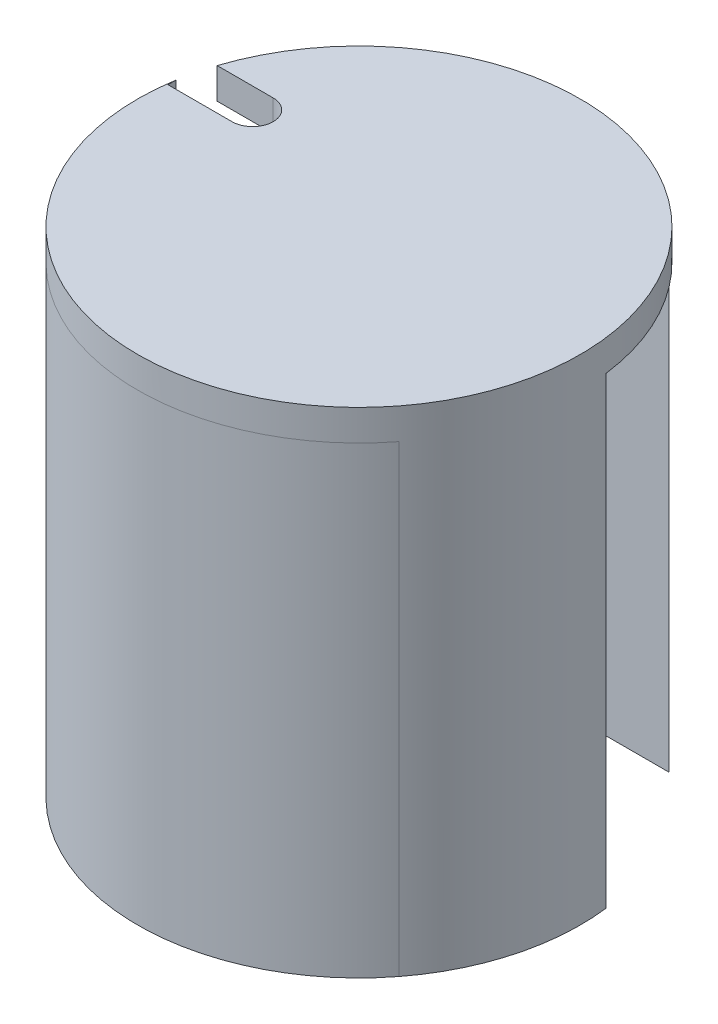
ISO-10303-21;
HEADER;
FILE_DESCRIPTION(('STEP AP214'),'2;1');
FILE_NAME('part.step','',(''),(''),'','','');
FILE_SCHEMA(('AUTOMOTIVE_DESIGN { 1 0 10303 214 1 1 1 1 }'));
ENDSEC;
DATA;
#1=APPLICATION_CONTEXT('core data for automotive mechanical design processes');
#2=APPLICATION_PROTOCOL_DEFINITION('international standard','automotive_design',2000,#1);
#3=PRODUCT_CONTEXT('',#1,'mechanical');
#4=PRODUCT('Part','Part','',(#3));
#5=PRODUCT_RELATED_PRODUCT_CATEGORY('part','',(#4));
#6=PRODUCT_DEFINITION_FORMATION('','',#4);
#7=PRODUCT_DEFINITION_CONTEXT('part definition',#1,'design');
#8=PRODUCT_DEFINITION('design','',#6,#7);
#9=PRODUCT_DEFINITION_SHAPE('','',#8);
#10=(LENGTH_UNIT() NAMED_UNIT(*) SI_UNIT(.MILLI.,.METRE.));
#11=(NAMED_UNIT(*) PLANE_ANGLE_UNIT() SI_UNIT($,.RADIAN.));
#12=(NAMED_UNIT(*) SI_UNIT($,.STERADIAN.) SOLID_ANGLE_UNIT());
#13=UNCERTAINTY_MEASURE_WITH_UNIT(LENGTH_MEASURE(1.E-05),#10,'distance_accuracy_value','');
#14=(GEOMETRIC_REPRESENTATION_CONTEXT(3) GLOBAL_UNCERTAINTY_ASSIGNED_CONTEXT((#13)) GLOBAL_UNIT_ASSIGNED_CONTEXT((#10,
#11,#12)) REPRESENTATION_CONTEXT('',''));
#15=CARTESIAN_POINT('',(0.,0.,0.));
#16=DIRECTION('',(0.,0.,1.));
#17=DIRECTION('',(1.,0.,0.));
#18=AXIS2_PLACEMENT_3D('',#15,#16,#17);
#19=CARTESIAN_POINT('',(9.8984935077699,45.,-2.16704366808773));
#20=DIRECTION('',(0.,-1.,0.));
#21=DIRECTION('',(0.,0.,-1.));
#22=AXIS2_PLACEMENT_3D('',#19,#20,#21);
#23=CYLINDRICAL_SURFACE('',#22,21.5);
#24=CARTESIAN_POINT('',(9.8984935077699,0.,-2.16704366808773));
#25=DIRECTION('',(0.,1.,0.));
#26=DIRECTION('',(0.,0.,1.));
#27=AXIS2_PLACEMENT_3D('',#24,#25,#26);
#28=CIRCLE('',#27,21.5);
#29=CARTESIAN_POINT('',(-7.12233982556345,0.,10.9684514744217));
#30=VERTEX_POINT('',#29);
#31=CARTESIAN_POINT('',(26.9193268411032,0.,10.9684514744217));
#32=VERTEX_POINT('',#31);
#33=EDGE_CURVE('E138',#30,#32,#28,.T.);
#34=ORIENTED_EDGE('',*,*,#33,.T.);
#35=DIRECTION('',(0.,-1.,0.));
#36=VECTOR('',#35,1.);
#37=CARTESIAN_POINT('',(26.9193268411032,45.,10.9684514744217));
#38=LINE('',#37,#36);
#39=CARTESIAN_POINT('',(26.9193268411032,45.,10.9684514744217));
#40=VERTEX_POINT('',#39);
#41=EDGE_CURVE('E13',#40,#32,#38,.T.);
#42=ORIENTED_EDGE('',*,*,#41,.F.);
#43=CARTESIAN_POINT('',(9.8984935077699,45.,-2.16704366808773));
#44=DIRECTION('',(0.,1.,0.));
#45=DIRECTION('',(0.,0.,1.));
#46=AXIS2_PLACEMENT_3D('',#43,#44,#45);
#47=CIRCLE('',#46,21.5);
#48=CARTESIAN_POINT('',(-7.12233982556345,45.,10.9684514744217));
#49=VERTEX_POINT('',#48);
#50=EDGE_CURVE('E115',#49,#40,#47,.T.);
#51=ORIENTED_EDGE('',*,*,#50,.F.);
#52=DIRECTION('',(0.,-1.,0.));
#53=VECTOR('',#52,1.);
#54=CARTESIAN_POINT('',(-7.12233982556345,45.,10.9684514744217));
#55=LINE('',#54,#53);
#56=EDGE_CURVE('E91',#49,#30,#55,.T.);
#57=ORIENTED_EDGE('',*,*,#56,.T.);
#58=EDGE_LOOP('',(#34,#42,#51,#57));
#59=FACE_BOUND('',#58,.T.);
#60=ADVANCED_FACE('F75',(#59),#23,.T.);
#61=CARTESIAN_POINT('',(19.3984935077699,45.,5.16439548121986));
#62=DIRECTION('',(0.,-1.,0.));
#63=DIRECTION('',(0.,0.,-1.));
#64=AXIS2_PLACEMENT_3D('',#61,#62,#63);
#65=CYLINDRICAL_SURFACE('',#64,9.50000000000001);
#66=CARTESIAN_POINT('',(19.3984935077699,0.,5.16439548121986));
#67=DIRECTION('',(0.,1.,0.));
#68=DIRECTION('',(0.,0.,1.));
#69=AXIS2_PLACEMENT_3D('',#66,#67,#68);
#70=CIRCLE('',#69,9.50000000000001);
#71=CARTESIAN_POINT('',(19.3984935077699,0.,14.6643954812199));
#72=VERTEX_POINT('',#71);
#73=EDGE_CURVE('E124',#72,#32,#70,.T.);
#74=ORIENTED_EDGE('',*,*,#73,.F.);
#75=DIRECTION('',(0.,-1.,0.));
#76=VECTOR('',#75,1.);
#77=CARTESIAN_POINT('',(19.3984935077699,45.,14.6643954812199));
#78=LINE('',#77,#76);
#79=CARTESIAN_POINT('',(19.3984935077699,45.,14.6643954812199));
#80=VERTEX_POINT('',#79);
#81=EDGE_CURVE('E83',#80,#72,#78,.T.);
#82=ORIENTED_EDGE('',*,*,#81,.F.);
#83=CARTESIAN_POINT('',(19.3984935077699,45.,5.16439548121986));
#84=DIRECTION('',(0.,1.,0.));
#85=DIRECTION('',(0.,0.,1.));
#86=AXIS2_PLACEMENT_3D('',#83,#84,#85);
#87=CIRCLE('',#86,9.50000000000001);
#88=EDGE_CURVE('E122',#80,#40,#87,.T.);
#89=ORIENTED_EDGE('',*,*,#88,.T.);
#90=ORIENTED_EDGE('',*,*,#41,.T.);
#91=EDGE_LOOP('',(#74,#82,#89,#90));
#92=FACE_BOUND('',#91,.T.);
#93=ADVANCED_FACE('F121',(#92),#65,.F.);
#94=CARTESIAN_POINT('',(0.,45.,14.6643954812199));
#95=DIRECTION('',(0.,0.,-1.));
#96=DIRECTION('',(-1.,0.,0.));
#97=AXIS2_PLACEMENT_3D('',#94,#95,#96);
#98=PLANE('',#97);
#99=DIRECTION('',(1.,0.,0.));
#100=VECTOR('',#99,1.);
#101=CARTESIAN_POINT('',(0.,0.,14.6643954812199));
#102=LINE('',#101,#100);
#103=CARTESIAN_POINT('',(0.3984935077699,0.,14.6643954812199));
#104=VERTEX_POINT('',#103);
#105=EDGE_CURVE('E141',#104,#72,#102,.T.);
#106=ORIENTED_EDGE('',*,*,#105,.F.);
#107=DIRECTION('',(0.,-1.,0.));
#108=VECTOR('',#107,1.);
#109=CARTESIAN_POINT('',(0.3984935077699,45.,14.6643954812199));
#110=LINE('',#109,#108);
#111=CARTESIAN_POINT('',(0.3984935077699,45.,14.6643954812199));
#112=VERTEX_POINT('',#111);
#113=EDGE_CURVE('E104',#112,#104,#110,.T.);
#114=ORIENTED_EDGE('',*,*,#113,.F.);
#115=DIRECTION('',(1.,0.,0.));
#116=VECTOR('',#115,1.);
#117=CARTESIAN_POINT('',(0.,45.,14.6643954812199));
#118=LINE('',#117,#116);
#119=EDGE_CURVE('E130',#112,#80,#118,.T.);
#120=ORIENTED_EDGE('',*,*,#119,.T.);
#121=ORIENTED_EDGE('',*,*,#81,.T.);
#122=EDGE_LOOP('',(#106,#114,#120,#121));
#123=FACE_BOUND('',#122,.T.);
#124=ADVANCED_FACE('F132',(#123),#98,.T.);
#125=CARTESIAN_POINT('',(0.3984935077699,45.,5.16439548121986));
#126=DIRECTION('',(0.,-1.,0.));
#127=DIRECTION('',(0.,0.,-1.));
#128=AXIS2_PLACEMENT_3D('',#125,#126,#127);
#129=CYLINDRICAL_SURFACE('',#128,9.5);
#130=CARTESIAN_POINT('',(0.3984935077699,0.,5.16439548121986));
#131=DIRECTION('',(0.,1.,0.));
#132=DIRECTION('',(0.,0.,1.));
#133=AXIS2_PLACEMENT_3D('',#130,#131,#132);
#134=CIRCLE('',#133,9.5);
#135=EDGE_CURVE('E143',#30,#104,#134,.T.);
#136=ORIENTED_EDGE('',*,*,#135,.F.);
#137=ORIENTED_EDGE('',*,*,#56,.F.);
#138=CARTESIAN_POINT('',(0.3984935077699,45.,5.16439548121986));
#139=DIRECTION('',(0.,1.,0.));
#140=DIRECTION('',(0.,0.,1.));
#141=AXIS2_PLACEMENT_3D('',#138,#139,#140);
#142=CIRCLE('',#141,9.5);
#143=EDGE_CURVE('E133',#49,#112,#142,.T.);
#144=ORIENTED_EDGE('',*,*,#143,.T.);
#145=ORIENTED_EDGE('',*,*,#113,.T.);
#146=EDGE_LOOP('',(#136,#137,#144,#145));
#147=FACE_BOUND('',#146,.T.);
#148=ADVANCED_FACE('F149',(#147),#129,.F.);
#149=CARTESIAN_POINT('',(0.,45.,0.));
#150=DIRECTION('',(0.,1.,0.));
#151=DIRECTION('',(0.,0.,1.));
#152=AXIS2_PLACEMENT_3D('',#149,#150,#151);
#153=PLANE('',#152);
#154=ORIENTED_EDGE('',*,*,#50,.T.);
#155=ORIENTED_EDGE('',*,*,#88,.F.);
#156=ORIENTED_EDGE('',*,*,#119,.F.);
#157=ORIENTED_EDGE('',*,*,#143,.F.);
#158=EDGE_LOOP('',(#154,#155,#156,#157));
#159=FACE_BOUND('',#158,.T.);
#160=ADVANCED_FACE('F129',(#159),#153,.T.);
#161=CARTESIAN_POINT('',(0.,0.,0.));
#162=DIRECTION('',(0.,1.,0.));
#163=DIRECTION('',(0.,0.,1.));
#164=AXIS2_PLACEMENT_3D('',#161,#162,#163);
#165=PLANE('',#164);
#166=ORIENTED_EDGE('',*,*,#33,.F.);
#167=ORIENTED_EDGE('',*,*,#135,.T.);
#168=ORIENTED_EDGE('',*,*,#105,.T.);
#169=ORIENTED_EDGE('',*,*,#73,.T.);
#170=EDGE_LOOP('',(#166,#167,#168,#169));
#171=FACE_BOUND('',#170,.T.);
#172=ADVANCED_FACE('F148',(#171),#165,.F.);
#173=CLOSED_SHELL('',(#60,#93,#124,#148,#160,#172));
#174=MANIFOLD_SOLID_BREP('B2',#173);
#175=CARTESIAN_POINT('',(9.8984935077699,45.,-2.16704366808773));
#176=DIRECTION('',(0.,1.,0.));
#177=DIRECTION('',(0.,0.,1.));
#178=AXIS2_PLACEMENT_3D('',#175,#176,#177);
#179=PLANE('',#178);
#180=CARTESIAN_POINT('',(9.8984935077699,45.,-2.16704366808773));
#181=DIRECTION('',(0.,1.,0.));
#182=DIRECTION('',(0.,0.,1.));
#183=AXIS2_PLACEMENT_3D('',#180,#181,#182);
#184=CIRCLE('',#183,21.5);
#185=CARTESIAN_POINT('',(-11.3244081744597,45.,-5.60774769290833));
#186=VERTEX_POINT('',#185);
#187=CARTESIAN_POINT('',(-11.4352540061141,45.,-4.83560451878014));
#188=VERTEX_POINT('',#187);
#189=EDGE_CURVE('E383',#186,#188,#184,.T.);
#190=ORIENTED_EDGE('',*,*,#189,.F.);
#191=DIRECTION('',(0.,0.,-1.));
#192=VECTOR('',#191,1.);
#193=CARTESIAN_POINT('',(-11.3244081744597,45.,0.));
#194=LINE('',#193,#192);
#195=CARTESIAN_POINT('',(-11.3244081744597,45.,-4.83560451878014));
#196=VERTEX_POINT('',#195);
#197=EDGE_CURVE('E352',#196,#186,#194,.T.);
#198=ORIENTED_EDGE('',*,*,#197,.F.);
#199=DIRECTION('',(1.,0.,0.));
#200=VECTOR('',#199,1.);
#201=CARTESIAN_POINT('',(0.,45.,-4.83560451878014));
#202=LINE('',#201,#200);
#203=EDGE_CURVE('E441',#188,#196,#202,.T.);
#204=ORIENTED_EDGE('',*,*,#203,.F.);
#205=EDGE_LOOP('',(#190,#198,#204));
#206=FACE_BOUND('',#205,.T.);
#207=ADVANCED_FACE('F214',(#206),#179,.F.);
#208=CARTESIAN_POINT('',(0.,45.,-4.83560451878014));
#209=DIRECTION('',(0.,0.,-1.));
#210=DIRECTION('',(-1.,0.,0.));
#211=AXIS2_PLACEMENT_3D('',#208,#209,#210);
#212=PLANE('',#211);
#213=ORIENTED_EDGE('',*,*,#203,.T.);
#214=DIRECTION('',(0.,-1.,0.));
#215=VECTOR('',#214,1.);
#216=CARTESIAN_POINT('',(-11.3244081744597,55.,-4.83560451878014));
#217=LINE('',#216,#215);
#218=CARTESIAN_POINT('',(-11.3244081744597,48.,-4.83560451878014));
#219=VERTEX_POINT('',#218);
#220=EDGE_CURVE('E374',#219,#196,#217,.T.);
#221=ORIENTED_EDGE('',*,*,#220,.F.);
#222=DIRECTION('',(1.,0.,0.));
#223=VECTOR('',#222,1.);
#224=CARTESIAN_POINT('',(9.8984935077699,48.,-4.83560451878014));
#225=LINE('',#224,#223);
#226=CARTESIAN_POINT('',(-5.1015064922301,48.,-4.83560451878014));
#227=VERTEX_POINT('',#226);
#228=EDGE_CURVE('E482',#219,#227,#225,.T.);
#229=ORIENTED_EDGE('',*,*,#228,.T.);
#230=DIRECTION('',(0.,-1.,0.));
#231=VECTOR('',#230,1.);
#232=CARTESIAN_POINT('',(-5.1015064922301,55.,-4.83560451878014));
#233=LINE('',#232,#231);
#234=CARTESIAN_POINT('',(-5.1015064922301,45.,-4.83560451878014));
#235=VERTEX_POINT('',#234);
#236=EDGE_CURVE('E229',#227,#235,#233,.T.);
#237=ORIENTED_EDGE('',*,*,#236,.T.);
#238=CARTESIAN_POINT('',(-2.10150649223011,45.,-4.83560451878014));
#239=VERTEX_POINT('',#238);
#240=EDGE_CURVE('E365',#235,#239,#202,.T.);
#241=ORIENTED_EDGE('',*,*,#240,.T.);
#242=DIRECTION('',(0.,-1.,0.));
#243=VECTOR('',#242,1.);
#244=CARTESIAN_POINT('',(-2.10150649223011,0.,-4.83560451878014));
#245=LINE('',#244,#243);
#246=CARTESIAN_POINT('',(-2.10150649223011,0.,-4.83560451878014));
#247=VERTEX_POINT('',#246);
#248=EDGE_CURVE('E409',#239,#247,#245,.T.);
#249=ORIENTED_EDGE('',*,*,#248,.T.);
#250=DIRECTION('',(1.,0.,0.));
#251=VECTOR('',#250,1.);
#252=CARTESIAN_POINT('',(0.,0.,-4.83560451878014));
#253=LINE('',#252,#251);
#254=CARTESIAN_POINT('',(-11.4352540061141,0.,-4.83560451878014));
#255=VERTEX_POINT('',#254);
#256=EDGE_CURVE('E457',#255,#247,#253,.T.);
#257=ORIENTED_EDGE('',*,*,#256,.F.);
#258=DIRECTION('',(0.,-1.,0.));
#259=VECTOR('',#258,1.);
#260=CARTESIAN_POINT('',(-11.4352540061141,45.,-4.83560451878014));
#261=LINE('',#260,#259);
#262=EDGE_CURVE('E474',#188,#255,#261,.T.);
#263=ORIENTED_EDGE('',*,*,#262,.F.);
#264=EDGE_LOOP('',(#213,#221,#229,#237,#241,#249,#257,#263));
#265=FACE_BOUND('',#264,.T.);
#266=ADVANCED_FACE('F492',(#265),#212,.T.);
#267=DIRECTION('',(-1.,0.,0.));
#268=VECTOR('',#267,1.);
#269=CARTESIAN_POINT('',(0.,42.,-4.83560451878014));
#270=LINE('',#269,#268);
#271=CARTESIAN_POINT('',(24.8984935077699,42.,-4.83560451878014));
#272=VERTEX_POINT('',#271);
#273=CARTESIAN_POINT('',(-0.101506492230105,42.,-4.83560451878014));
#274=VERTEX_POINT('',#273);
#275=EDGE_CURVE('E237',#272,#274,#270,.T.);
#276=ORIENTED_EDGE('',*,*,#275,.F.);
#277=DIRECTION('',(0.,-1.,0.));
#278=VECTOR('',#277,1.);
#279=CARTESIAN_POINT('',(24.8984935077699,0.,-4.83560451878014));
#280=LINE('',#279,#278);
#281=CARTESIAN_POINT('',(24.8984935077699,0.,-4.83560451878014));
#282=VERTEX_POINT('',#281);
#283=EDGE_CURVE('E388',#272,#282,#280,.T.);
#284=ORIENTED_EDGE('',*,*,#283,.T.);
#285=CARTESIAN_POINT('',(-0.101506492230109,0.,-4.83560451878014));
#286=VERTEX_POINT('',#285);
#287=EDGE_CURVE('E461',#286,#282,#253,.T.);
#288=ORIENTED_EDGE('',*,*,#287,.F.);
#289=DIRECTION('',(0.,-1.,0.));
#290=VECTOR('',#289,1.);
#291=CARTESIAN_POINT('',(-0.101506492230109,0.,-4.83560451878014));
#292=LINE('',#291,#290);
#293=EDGE_CURVE('E406',#274,#286,#292,.T.);
#294=ORIENTED_EDGE('',*,*,#293,.F.);
#295=EDGE_LOOP('',(#276,#284,#288,#294));
#296=FACE_BOUND('',#295,.T.);
#297=ADVANCED_FACE('F512',(#296),#212,.T.);
#298=CARTESIAN_POINT('',(19.3984935077699,45.,5.16439548121986));
#299=DIRECTION('',(0.,-1.,0.));
#300=DIRECTION('',(0.,0.,-1.));
#301=AXIS2_PLACEMENT_3D('',#298,#299,#300);
#302=CYLINDRICAL_SURFACE('',#301,9.50000000000001);
#303=CARTESIAN_POINT('',(19.3984935077699,0.,5.16439548121986));
#304=DIRECTION('',(0.,1.,0.));
#305=DIRECTION('',(0.,0.,1.));
#306=AXIS2_PLACEMENT_3D('',#303,#304,#305);
#307=CIRCLE('',#306,9.50000000000001);
#308=CARTESIAN_POINT('',(26.9193268411032,0.,10.9684514744217));
#309=VERTEX_POINT('',#308);
#310=CARTESIAN_POINT('',(19.3984935077699,0.,-4.33560451878014));
#311=VERTEX_POINT('',#310);
#312=EDGE_CURVE('E436',#309,#311,#307,.T.);
#313=ORIENTED_EDGE('',*,*,#312,.F.);
#314=DIRECTION('',(0.,-1.,0.));
#315=VECTOR('',#314,1.);
#316=CARTESIAN_POINT('',(26.9193268411032,45.,10.9684514744217));
#317=LINE('',#316,#315);
#318=CARTESIAN_POINT('',(26.9193268411032,45.,10.9684514744217));
#319=VERTEX_POINT('',#318);
#320=EDGE_CURVE('E479',#319,#309,#317,.T.);
#321=ORIENTED_EDGE('',*,*,#320,.F.);
#322=CARTESIAN_POINT('',(19.3984935077699,45.,5.16439548121986));
#323=DIRECTION('',(0.,1.,0.));
#324=DIRECTION('',(0.,0.,1.));
#325=AXIS2_PLACEMENT_3D('',#322,#323,#324);
#326=CIRCLE('',#325,9.50000000000001);
#327=CARTESIAN_POINT('',(19.3984935077699,45.,-4.33560451878014));
#328=VERTEX_POINT('',#327);
#329=EDGE_CURVE('E437',#319,#328,#326,.T.);
#330=ORIENTED_EDGE('',*,*,#329,.T.);
#331=DIRECTION('',(0.,-1.,0.));
#332=VECTOR('',#331,1.);
#333=CARTESIAN_POINT('',(19.3984935077699,45.,-4.33560451878014));
#334=LINE('',#333,#332);
#335=EDGE_CURVE('E450',#328,#311,#334,.T.);
#336=ORIENTED_EDGE('',*,*,#335,.T.);
#337=EDGE_LOOP('',(#313,#321,#330,#336));
#338=FACE_BOUND('',#337,.T.);
#339=ADVANCED_FACE('F216',(#338),#302,.F.);
#340=DIRECTION('',(0.,-1.,0.));
#341=VECTOR('',#340,1.);
#342=CARTESIAN_POINT('',(26.8984935077699,0.,-4.83560451878014));
#343=LINE('',#342,#341);
#344=CARTESIAN_POINT('',(26.8984935077699,45.,-4.83560451878014));
#345=VERTEX_POINT('',#344);
#346=CARTESIAN_POINT('',(26.8984935077699,0.,-4.83560451878014));
#347=VERTEX_POINT('',#346);
#348=EDGE_CURVE('E411',#345,#347,#343,.T.);
#349=ORIENTED_EDGE('',*,*,#348,.F.);
#350=CARTESIAN_POINT('',(31.2322410216539,45.,-4.83560451878014));
#351=VERTEX_POINT('',#350);
#352=EDGE_CURVE('E439',#345,#351,#202,.T.);
#353=ORIENTED_EDGE('',*,*,#352,.T.);
#354=DIRECTION('',(0.,-1.,0.));
#355=VECTOR('',#354,1.);
#356=CARTESIAN_POINT('',(31.2322410216539,45.,-4.83560451878014));
#357=LINE('',#356,#355);
#358=CARTESIAN_POINT('',(31.2322410216539,0.,-4.83560451878014));
#359=VERTEX_POINT('',#358);
#360=EDGE_CURVE('E476',#351,#359,#357,.T.);
#361=ORIENTED_EDGE('',*,*,#360,.T.);
#362=EDGE_CURVE('E456',#347,#359,#253,.T.);
#363=ORIENTED_EDGE('',*,*,#362,.F.);
#364=EDGE_LOOP('',(#349,#353,#361,#363));
#365=FACE_BOUND('',#364,.T.);
#366=ADVANCED_FACE('F513',(#365),#212,.T.);
#367=CARTESIAN_POINT('',(9.8984935077699,45.,-2.16704366808773));
#368=DIRECTION('',(0.,-1.,0.));
#369=DIRECTION('',(0.,0.,-1.));
#370=AXIS2_PLACEMENT_3D('',#367,#368,#369);
#371=CYLINDRICAL_SURFACE('',#370,21.5);
#372=CARTESIAN_POINT('',(-10.5411810537443,45.,-8.83560451878014));
#373=VERTEX_POINT('',#372);
#374=EDGE_CURVE('E380',#351,#373,#184,.T.);
#375=ORIENTED_EDGE('',*,*,#374,.T.);
#376=DIRECTION('',(0.,-1.,0.));
#377=VECTOR('',#376,1.);
#378=CARTESIAN_POINT('',(-10.5411810537443,55.,-8.83560451878014));
#379=LINE('',#378,#377);
#380=CARTESIAN_POINT('',(-10.5411810537443,48.,-8.83560451878014));
#381=VERTEX_POINT('',#380);
#382=EDGE_CURVE('E358',#381,#373,#379,.T.);
#383=ORIENTED_EDGE('',*,*,#382,.F.);
#384=CARTESIAN_POINT('',(9.8984935077699,48.,-2.16704366808773));
#385=DIRECTION('',(0.,1.,0.));
#386=DIRECTION('',(0.,0.,1.));
#387=AXIS2_PLACEMENT_3D('',#384,#385,#386);
#388=CIRCLE('',#387,21.5);
#389=CARTESIAN_POINT('',(-11.3244081744597,48.,-5.60774769290833));
#390=VERTEX_POINT('',#389);
#391=EDGE_CURVE('E377',#390,#381,#388,.T.);
#392=ORIENTED_EDGE('',*,*,#391,.F.);
#393=DIRECTION('',(0.,-1.,0.));
#394=VECTOR('',#393,1.);
#395=CARTESIAN_POINT('',(-11.3244081744597,55.,-5.60774769290833));
#396=LINE('',#395,#394);
#397=EDGE_CURVE('E371',#390,#186,#396,.T.);
#398=ORIENTED_EDGE('',*,*,#397,.T.);
#399=ORIENTED_EDGE('',*,*,#189,.T.);
#400=ORIENTED_EDGE('',*,*,#262,.T.);
#401=CARTESIAN_POINT('',(9.8984935077699,0.,-2.16704366808773));
#402=DIRECTION('',(0.,1.,0.));
#403=DIRECTION('',(0.,0.,1.));
#404=AXIS2_PLACEMENT_3D('',#401,#402,#403);
#405=CIRCLE('',#404,21.5);
#406=CARTESIAN_POINT('',(-7.12233982556345,0.,10.9684514744217));
#407=VERTEX_POINT('',#406);
#408=EDGE_CURVE('E460',#255,#407,#405,.T.);
#409=ORIENTED_EDGE('',*,*,#408,.T.);
#410=DIRECTION('',(0.,-1.,0.));
#411=VECTOR('',#410,1.);
#412=CARTESIAN_POINT('',(-7.12233982556345,45.,10.9684514744217));
#413=LINE('',#412,#411);
#414=CARTESIAN_POINT('',(-7.12233982556345,45.,10.9684514744217));
#415=VERTEX_POINT('',#414);
#416=EDGE_CURVE('E472',#415,#407,#413,.T.);
#417=ORIENTED_EDGE('',*,*,#416,.F.);
#418=EDGE_CURVE('E370',#415,#319,#184,.T.);
#419=ORIENTED_EDGE('',*,*,#418,.T.);
#420=ORIENTED_EDGE('',*,*,#320,.T.);
#421=CARTESIAN_POINT('',(9.8984935077699,0.,-2.16704366808773));
#422=DIRECTION('',(0.,1.,0.));
#423=DIRECTION('',(0.,0.,1.));
#424=AXIS2_PLACEMENT_3D('',#421,#422,#423);
#425=CIRCLE('',#424,21.5);
#426=EDGE_CURVE('E453',#309,#359,#425,.T.);
#427=ORIENTED_EDGE('',*,*,#426,.T.);
#428=ORIENTED_EDGE('',*,*,#360,.F.);
#429=EDGE_LOOP('',(#375,#383,#392,#398,#399,#400,#409,#417,#419,#420,#427,#428));
#430=FACE_BOUND('',#429,.T.);
#431=ADVANCED_FACE('F497',(#430),#371,.T.);
#432=CARTESIAN_POINT('',(0.3984935077699,45.,5.16439548121986));
#433=DIRECTION('',(0.,-1.,0.));
#434=DIRECTION('',(0.,0.,-1.));
#435=AXIS2_PLACEMENT_3D('',#432,#433,#434);
#436=CYLINDRICAL_SURFACE('',#435,9.5);
#437=CARTESIAN_POINT('',(0.3984935077699,0.,5.16439548121986));
#438=DIRECTION('',(0.,1.,0.));
#439=DIRECTION('',(0.,0.,1.));
#440=AXIS2_PLACEMENT_3D('',#437,#438,#439);
#441=CIRCLE('',#440,9.5);
#442=CARTESIAN_POINT('',(0.3984935077699,0.,-4.33560451878014));
#443=VERTEX_POINT('',#442);
#444=EDGE_CURVE('E464',#443,#407,#441,.T.);
#445=ORIENTED_EDGE('',*,*,#444,.F.);
#446=DIRECTION('',(0.,-1.,0.));
#447=VECTOR('',#446,1.);
#448=CARTESIAN_POINT('',(0.3984935077699,45.,-4.33560451878014));
#449=LINE('',#448,#447);
#450=CARTESIAN_POINT('',(0.3984935077699,45.,-4.33560451878014));
#451=VERTEX_POINT('',#450);
#452=EDGE_CURVE('E470',#451,#443,#449,.T.);
#453=ORIENTED_EDGE('',*,*,#452,.F.);
#454=CARTESIAN_POINT('',(0.3984935077699,45.,5.16439548121986));
#455=DIRECTION('',(0.,1.,0.));
#456=DIRECTION('',(0.,0.,1.));
#457=AXIS2_PLACEMENT_3D('',#454,#455,#456);
#458=CIRCLE('',#457,9.5);
#459=EDGE_CURVE('E444',#451,#415,#458,.T.);
#460=ORIENTED_EDGE('',*,*,#459,.T.);
#461=ORIENTED_EDGE('',*,*,#416,.T.);
#462=EDGE_LOOP('',(#445,#453,#460,#461));
#463=FACE_BOUND('',#462,.T.);
#464=ADVANCED_FACE('F535',(#463),#436,.F.);
#465=CARTESIAN_POINT('',(0.,45.,-4.33560451878014));
#466=DIRECTION('',(0.,0.,-1.));
#467=DIRECTION('',(-1.,0.,0.));
#468=AXIS2_PLACEMENT_3D('',#465,#466,#467);
#469=PLANE('',#468);
#470=DIRECTION('',(1.,0.,0.));
#471=VECTOR('',#470,1.);
#472=CARTESIAN_POINT('',(0.,0.,-4.33560451878014));
#473=LINE('',#472,#471);
#474=EDGE_CURVE('E440',#443,#311,#473,.T.);
#475=ORIENTED_EDGE('',*,*,#474,.T.);
#476=ORIENTED_EDGE('',*,*,#335,.F.);
#477=DIRECTION('',(1.,0.,0.));
#478=VECTOR('',#477,1.);
#479=CARTESIAN_POINT('',(0.,45.,-4.33560451878014));
#480=LINE('',#479,#478);
#481=EDGE_CURVE('E447',#451,#328,#480,.T.);
#482=ORIENTED_EDGE('',*,*,#481,.F.);
#483=ORIENTED_EDGE('',*,*,#452,.T.);
#484=EDGE_LOOP('',(#475,#476,#482,#483));
#485=FACE_BOUND('',#484,.T.);
#486=ADVANCED_FACE('F538',(#485),#469,.F.);
#487=CARTESIAN_POINT('',(0.,0.,0.));
#488=DIRECTION('',(0.,1.,0.));
#489=DIRECTION('',(0.,0.,1.));
#490=AXIS2_PLACEMENT_3D('',#487,#488,#489);
#491=PLANE('',#490);
#492=ORIENTED_EDGE('',*,*,#312,.T.);
#493=ORIENTED_EDGE('',*,*,#474,.F.);
#494=ORIENTED_EDGE('',*,*,#444,.T.);
#495=ORIENTED_EDGE('',*,*,#408,.F.);
#496=ORIENTED_EDGE('',*,*,#256,.T.);
#497=DIRECTION('',(0.,0.,1.));
#498=VECTOR('',#497,1.);
#499=CARTESIAN_POINT('',(-2.10150649223011,0.,-7.83560451878014));
#500=LINE('',#499,#498);
#501=CARTESIAN_POINT('',(-2.10150649223011,0.,-7.83560451878014));
#502=VERTEX_POINT('',#501);
#503=EDGE_CURVE('E427',#502,#247,#500,.T.);
#504=ORIENTED_EDGE('',*,*,#503,.F.);
#505=DIRECTION('',(-1.,0.,0.));
#506=VECTOR('',#505,1.);
#507=CARTESIAN_POINT('',(0.,0.,-7.83560451878014));
#508=LINE('',#507,#506);
#509=CARTESIAN_POINT('',(-0.101506492230109,0.,-7.83560451878014));
#510=VERTEX_POINT('',#509);
#511=EDGE_CURVE('E390',#510,#502,#508,.T.);
#512=ORIENTED_EDGE('',*,*,#511,.F.);
#513=DIRECTION('',(0.,0.,1.));
#514=VECTOR('',#513,1.);
#515=CARTESIAN_POINT('',(-0.101506492230109,0.,-7.83560451878014));
#516=LINE('',#515,#514);
#517=EDGE_CURVE('E430',#510,#286,#516,.T.);
#518=ORIENTED_EDGE('',*,*,#517,.T.);
#519=ORIENTED_EDGE('',*,*,#287,.T.);
#520=DIRECTION('',(0.,0.,1.));
#521=VECTOR('',#520,1.);
#522=CARTESIAN_POINT('',(24.8984935077699,0.,-7.83560451878014));
#523=LINE('',#522,#521);
#524=CARTESIAN_POINT('',(24.8984935077699,0.,-7.83560451878014));
#525=VERTEX_POINT('',#524);
#526=EDGE_CURVE('E416',#525,#282,#523,.T.);
#527=ORIENTED_EDGE('',*,*,#526,.F.);
#528=DIRECTION('',(-1.,0.,0.));
#529=VECTOR('',#528,1.);
#530=CARTESIAN_POINT('',(0.,0.,-7.83560451878014));
#531=LINE('',#530,#529);
#532=CARTESIAN_POINT('',(26.8984935077699,0.,-7.83560451878014));
#533=VERTEX_POINT('',#532);
#534=EDGE_CURVE('E399',#533,#525,#531,.T.);
#535=ORIENTED_EDGE('',*,*,#534,.F.);
#536=DIRECTION('',(0.,0.,1.));
#537=VECTOR('',#536,1.);
#538=CARTESIAN_POINT('',(26.8984935077699,0.,-7.83560451878014));
#539=LINE('',#538,#537);
#540=EDGE_CURVE('E419',#533,#347,#539,.T.);
#541=ORIENTED_EDGE('',*,*,#540,.T.);
#542=ORIENTED_EDGE('',*,*,#362,.T.);
#543=ORIENTED_EDGE('',*,*,#426,.F.);
#544=EDGE_LOOP('',(#492,#493,#494,#495,#496,#504,#512,#518,#519,#527,#535,#541,#542,#543));
#545=FACE_BOUND('',#544,.T.);
#546=ADVANCED_FACE('F541',(#545),#491,.F.);
#547=CARTESIAN_POINT('',(0.,42.,-7.83560451878014));
#548=DIRECTION('',(0.,1.,0.));
#549=DIRECTION('',(0.,0.,1.));
#550=AXIS2_PLACEMENT_3D('',#547,#548,#549);
#551=PLANE('',#550);
#552=ORIENTED_EDGE('',*,*,#275,.T.);
#553=DIRECTION('',(0.,0.,1.));
#554=VECTOR('',#553,1.);
#555=CARTESIAN_POINT('',(-0.101506492230105,42.,-7.83560451878014));
#556=LINE('',#555,#554);
#557=CARTESIAN_POINT('',(-0.101506492230105,42.,-7.83560451878014));
#558=VERTEX_POINT('',#557);
#559=EDGE_CURVE('E433',#558,#274,#556,.T.);
#560=ORIENTED_EDGE('',*,*,#559,.F.);
#561=DIRECTION('',(-1.,0.,0.));
#562=VECTOR('',#561,1.);
#563=CARTESIAN_POINT('',(0.,42.,-7.83560451878014));
#564=LINE('',#563,#562);
#565=CARTESIAN_POINT('',(24.8984935077699,42.,-7.83560451878014));
#566=VERTEX_POINT('',#565);
#567=EDGE_CURVE('E384',#566,#558,#564,.T.);
#568=ORIENTED_EDGE('',*,*,#567,.F.);
#569=DIRECTION('',(0.,0.,1.));
#570=VECTOR('',#569,1.);
#571=CARTESIAN_POINT('',(24.8984935077699,42.,-7.83560451878014));
#572=LINE('',#571,#570);
#573=EDGE_CURVE('E404',#566,#272,#572,.T.);
#574=ORIENTED_EDGE('',*,*,#573,.T.);
#575=EDGE_LOOP('',(#552,#560,#568,#574));
#576=FACE_BOUND('',#575,.T.);
#577=ADVANCED_FACE('F565',(#576),#551,.F.);
#578=CARTESIAN_POINT('',(-0.101506492230109,0.,-7.83560451878014));
#579=DIRECTION('',(-1.,0.,0.));
#580=DIRECTION('',(0.,-1.,0.));
#581=AXIS2_PLACEMENT_3D('',#578,#579,#580);
#582=PLANE('',#581);
#583=ORIENTED_EDGE('',*,*,#293,.T.);
#584=ORIENTED_EDGE('',*,*,#517,.F.);
#585=DIRECTION('',(0.,-1.,0.));
#586=VECTOR('',#585,1.);
#587=CARTESIAN_POINT('',(-0.101506492230109,0.,-7.83560451878014));
#588=LINE('',#587,#586);
#589=EDGE_CURVE('E387',#558,#510,#588,.T.);
#590=ORIENTED_EDGE('',*,*,#589,.F.);
#591=ORIENTED_EDGE('',*,*,#559,.T.);
#592=EDGE_LOOP('',(#583,#584,#590,#591));
#593=FACE_BOUND('',#592,.T.);
#594=ADVANCED_FACE('F567',(#593),#582,.F.);
#595=CARTESIAN_POINT('',(-2.10150649223011,0.,-7.83560451878014));
#596=DIRECTION('',(-1.,0.,0.));
#597=DIRECTION('',(0.,-1.,0.));
#598=AXIS2_PLACEMENT_3D('',#595,#596,#597);
#599=PLANE('',#598);
#600=ORIENTED_EDGE('',*,*,#248,.F.);
#601=DIRECTION('',(0.,0.,1.));
#602=VECTOR('',#601,1.);
#603=CARTESIAN_POINT('',(-2.1015064922301,45.,-7.83560451878014));
#604=LINE('',#603,#602);
#605=CARTESIAN_POINT('',(-2.1015064922301,45.,-7.83560451878014));
#606=VERTEX_POINT('',#605);
#607=EDGE_CURVE('E425',#606,#239,#604,.T.);
#608=ORIENTED_EDGE('',*,*,#607,.F.);
#609=DIRECTION('',(0.,-1.,0.));
#610=VECTOR('',#609,1.);
#611=CARTESIAN_POINT('',(-2.10150649223011,0.,-7.83560451878014));
#612=LINE('',#611,#610);
#613=EDGE_CURVE('E392',#606,#502,#612,.T.);
#614=ORIENTED_EDGE('',*,*,#613,.T.);
#615=ORIENTED_EDGE('',*,*,#503,.T.);
#616=EDGE_LOOP('',(#600,#608,#614,#615));
#617=FACE_BOUND('',#616,.T.);
#618=ADVANCED_FACE('F548',(#617),#599,.T.);
#619=CARTESIAN_POINT('',(26.8984935077699,0.,-7.83560451878014));
#620=DIRECTION('',(-1.,0.,0.));
#621=DIRECTION('',(0.,-1.,0.));
#622=AXIS2_PLACEMENT_3D('',#619,#620,#621);
#623=PLANE('',#622);
#624=ORIENTED_EDGE('',*,*,#348,.T.);
#625=ORIENTED_EDGE('',*,*,#540,.F.);
#626=DIRECTION('',(0.,-1.,0.));
#627=VECTOR('',#626,1.);
#628=CARTESIAN_POINT('',(26.8984935077699,0.,-7.83560451878014));
#629=LINE('',#628,#627);
#630=CARTESIAN_POINT('',(26.8984935077699,45.,-7.83560451878014));
#631=VERTEX_POINT('',#630);
#632=EDGE_CURVE('E397',#631,#533,#629,.T.);
#633=ORIENTED_EDGE('',*,*,#632,.F.);
#634=DIRECTION('',(0.,0.,1.));
#635=VECTOR('',#634,1.);
#636=CARTESIAN_POINT('',(26.8984935077699,45.,-7.83560451878014));
#637=LINE('',#636,#635);
#638=EDGE_CURVE('E422',#631,#345,#637,.T.);
#639=ORIENTED_EDGE('',*,*,#638,.T.);
#640=EDGE_LOOP('',(#624,#625,#633,#639));
#641=FACE_BOUND('',#640,.T.);
#642=ADVANCED_FACE('F555',(#641),#623,.F.);
#643=CARTESIAN_POINT('',(24.8984935077699,0.,-7.83560451878014));
#644=DIRECTION('',(-1.,0.,0.));
#645=DIRECTION('',(0.,-1.,0.));
#646=AXIS2_PLACEMENT_3D('',#643,#644,#645);
#647=PLANE('',#646);
#648=ORIENTED_EDGE('',*,*,#283,.F.);
#649=ORIENTED_EDGE('',*,*,#573,.F.);
#650=DIRECTION('',(0.,-1.,0.));
#651=VECTOR('',#650,1.);
#652=CARTESIAN_POINT('',(24.8984935077699,0.,-7.83560451878014));
#653=LINE('',#652,#651);
#654=EDGE_CURVE('E401',#566,#525,#653,.T.);
#655=ORIENTED_EDGE('',*,*,#654,.T.);
#656=ORIENTED_EDGE('',*,*,#526,.T.);
#657=EDGE_LOOP('',(#648,#649,#655,#656));
#658=FACE_BOUND('',#657,.T.);
#659=ADVANCED_FACE('F563',(#658),#647,.T.);
#660=CARTESIAN_POINT('',(0.,0.,-7.83560451878014));
#661=DIRECTION('',(0.,0.,-1.));
#662=DIRECTION('',(-1.,0.,0.));
#663=AXIS2_PLACEMENT_3D('',#660,#661,#662);
#664=PLANE('',#663);
#665=ORIENTED_EDGE('',*,*,#567,.T.);
#666=ORIENTED_EDGE('',*,*,#589,.T.);
#667=ORIENTED_EDGE('',*,*,#511,.T.);
#668=ORIENTED_EDGE('',*,*,#613,.F.);
#669=DIRECTION('',(1.,0.,0.));
#670=VECTOR('',#669,1.);
#671=CARTESIAN_POINT('',(0.,45.,-7.83560451878014));
#672=LINE('',#671,#670);
#673=EDGE_CURVE('E395',#606,#631,#672,.T.);
#674=ORIENTED_EDGE('',*,*,#673,.T.);
#675=ORIENTED_EDGE('',*,*,#632,.T.);
#676=ORIENTED_EDGE('',*,*,#534,.T.);
#677=ORIENTED_EDGE('',*,*,#654,.F.);
#678=EDGE_LOOP('',(#665,#666,#667,#668,#674,#675,#676,#677));
#679=FACE_BOUND('',#678,.T.);
#680=ADVANCED_FACE('F517',(#679),#664,.T.);
#681=CARTESIAN_POINT('',(-5.1015064922301,45.,-6.83560451878014));
#682=DIRECTION('',(0.,-1.,0.));
#683=DIRECTION('',(0.,0.,-1.));
#684=AXIS2_PLACEMENT_3D('',#681,#682,#683);
#685=CIRCLE('',#684,2.);
#686=CARTESIAN_POINT('',(-5.1015064922301,45.,-8.83560451878014));
#687=VERTEX_POINT('',#686);
#688=EDGE_CURVE('E346',#687,#235,#685,.T.);
#689=ORIENTED_EDGE('',*,*,#688,.F.);
#690=DIRECTION('',(1.,0.,0.));
#691=VECTOR('',#690,1.);
#692=CARTESIAN_POINT('',(0.,45.,-8.83560451878014));
#693=LINE('',#692,#691);
#694=EDGE_CURVE('E355',#373,#687,#693,.T.);
#695=ORIENTED_EDGE('',*,*,#694,.F.);
#696=ORIENTED_EDGE('',*,*,#374,.F.);
#697=ORIENTED_EDGE('',*,*,#352,.F.);
#698=ORIENTED_EDGE('',*,*,#638,.F.);
#699=ORIENTED_EDGE('',*,*,#673,.F.);
#700=ORIENTED_EDGE('',*,*,#607,.T.);
#701=ORIENTED_EDGE('',*,*,#240,.F.);
#702=EDGE_LOOP('',(#689,#695,#696,#697,#698,#699,#700,#701));
#703=FACE_BOUND('',#702,.T.);
#704=ADVANCED_FACE('F363',(#703),#179,.F.);
#705=CARTESIAN_POINT('',(9.8984935077699,48.,-2.16704366808773));
#706=DIRECTION('',(0.,1.,0.));
#707=DIRECTION('',(0.,0.,1.));
#708=AXIS2_PLACEMENT_3D('',#705,#706,#707);
#709=PLANE('',#708);
#710=DIRECTION('',(-1.,0.,0.));
#711=VECTOR('',#710,1.);
#712=CARTESIAN_POINT('',(9.8984935077699,48.,-8.83560451878014));
#713=LINE('',#712,#711);
#714=CARTESIAN_POINT('',(-5.1015064922301,48.,-8.83560451878014));
#715=VERTEX_POINT('',#714);
#716=EDGE_CURVE('E73',#715,#381,#713,.T.);
#717=ORIENTED_EDGE('',*,*,#716,.F.);
#718=CARTESIAN_POINT('',(-5.1015064922301,48.,-6.83560451878014));
#719=DIRECTION('',(0.,1.,0.));
#720=DIRECTION('',(0.,0.,1.));
#721=AXIS2_PLACEMENT_3D('',#718,#719,#720);
#722=CIRCLE('',#721,2.);
#723=EDGE_CURVE('E349',#227,#715,#722,.T.);
#724=ORIENTED_EDGE('',*,*,#723,.F.);
#725=ORIENTED_EDGE('',*,*,#228,.F.);
#726=DIRECTION('',(0.,0.,1.));
#727=VECTOR('',#726,1.);
#728=CARTESIAN_POINT('',(-11.3244081744597,48.,-2.16704366808773));
#729=LINE('',#728,#727);
#730=EDGE_CURVE('E222',#390,#219,#729,.T.);
#731=ORIENTED_EDGE('',*,*,#730,.F.);
#732=ORIENTED_EDGE('',*,*,#391,.T.);
#733=EDGE_LOOP('',(#717,#724,#725,#731,#732));
#734=FACE_BOUND('',#733,.T.);
#735=ADVANCED_FACE('F495',(#734),#709,.T.);
#736=ORIENTED_EDGE('',*,*,#329,.F.);
#737=ORIENTED_EDGE('',*,*,#418,.F.);
#738=ORIENTED_EDGE('',*,*,#459,.F.);
#739=ORIENTED_EDGE('',*,*,#481,.T.);
#740=EDGE_LOOP('',(#736,#737,#738,#739));
#741=FACE_BOUND('',#740,.T.);
#742=ADVANCED_FACE('F506',(#741),#179,.F.);
#743=CARTESIAN_POINT('',(0.,55.,-8.83560451878014));
#744=DIRECTION('',(0.,0.,-1.));
#745=DIRECTION('',(-1.,0.,0.));
#746=AXIS2_PLACEMENT_3D('',#743,#744,#745);
#747=PLANE('',#746);
#748=ORIENTED_EDGE('',*,*,#716,.T.);
#749=ORIENTED_EDGE('',*,*,#382,.T.);
#750=ORIENTED_EDGE('',*,*,#694,.T.);
#751=DIRECTION('',(0.,-1.,0.));
#752=VECTOR('',#751,1.);
#753=CARTESIAN_POINT('',(-5.1015064922301,55.,-8.83560451878014));
#754=LINE('',#753,#752);
#755=EDGE_CURVE('E342',#715,#687,#754,.T.);
#756=ORIENTED_EDGE('',*,*,#755,.F.);
#757=EDGE_LOOP('',(#748,#749,#750,#756));
#758=FACE_BOUND('',#757,.T.);
#759=ADVANCED_FACE('F356',(#758),#747,.F.);
#760=CARTESIAN_POINT('',(-11.3244081744597,55.,0.));
#761=DIRECTION('',(-1.,0.,0.));
#762=DIRECTION('',(0.,0.,1.));
#763=AXIS2_PLACEMENT_3D('',#760,#761,#762);
#764=PLANE('',#763);
#765=ORIENTED_EDGE('',*,*,#730,.T.);
#766=ORIENTED_EDGE('',*,*,#220,.T.);
#767=ORIENTED_EDGE('',*,*,#197,.T.);
#768=ORIENTED_EDGE('',*,*,#397,.F.);
#769=EDGE_LOOP('',(#765,#766,#767,#768));
#770=FACE_BOUND('',#769,.T.);
#771=ADVANCED_FACE('F486',(#770),#764,.F.);
#772=CARTESIAN_POINT('',(-5.1015064922301,55.,-6.83560451878014));
#773=DIRECTION('',(0.,-1.,0.));
#774=DIRECTION('',(0.,0.,-1.));
#775=AXIS2_PLACEMENT_3D('',#772,#773,#774);
#776=CYLINDRICAL_SURFACE('',#775,2.);
#777=ORIENTED_EDGE('',*,*,#723,.T.);
#778=ORIENTED_EDGE('',*,*,#755,.T.);
#779=ORIENTED_EDGE('',*,*,#688,.T.);
#780=ORIENTED_EDGE('',*,*,#236,.F.);
#781=EDGE_LOOP('',(#777,#778,#779,#780));
#782=FACE_BOUND('',#781,.T.);
#783=ADVANCED_FACE('F344',(#782),#776,.F.);
#784=CLOSED_SHELL('',(#207,#266,#297,#339,#366,#431,#464,#486,#546,#577,#594,#618,#642,#659,
#680,#704,#735,#742,#759,#771,#783));
#785=MANIFOLD_SOLID_BREP('B7',#784);
#786=CARTESIAN_POINT('',(9.8984935077699,45.,-2.16704366808773));
#787=DIRECTION('',(0.,-1.,0.));
#788=DIRECTION('',(0.,0.,-1.));
#789=AXIS2_PLACEMENT_3D('',#786,#787,#788);
#790=CYLINDRICAL_SURFACE('',#789,21.5);
#791=CARTESIAN_POINT('',(9.8984935077699,0.,-2.16704366808773));
#792=DIRECTION('',(0.,1.,0.));
#793=DIRECTION('',(0.,0.,1.));
#794=AXIS2_PLACEMENT_3D('',#791,#792,#793);
#795=CIRCLE('',#794,21.5);
#796=CARTESIAN_POINT('',(22.8403062987228,0.,-19.3356045187801));
#797=VERTEX_POINT('',#796);
#798=CARTESIAN_POINT('',(-3.04331928318299,0.,-19.3356045187801));
#799=VERTEX_POINT('',#798);
#800=EDGE_CURVE('E790',#797,#799,#795,.T.);
#801=ORIENTED_EDGE('',*,*,#800,.T.);
#802=DIRECTION('',(0.,-1.,0.));
#803=VECTOR('',#802,1.);
#804=CARTESIAN_POINT('',(-3.04331928318299,45.,-19.3356045187801));
#805=LINE('',#804,#803);
#806=CARTESIAN_POINT('',(-3.04331928318299,45.,-19.3356045187801));
#807=VERTEX_POINT('',#806);
#808=EDGE_CURVE('E212',#807,#799,#805,.T.);
#809=ORIENTED_EDGE('',*,*,#808,.F.);
#810=CARTESIAN_POINT('',(9.8984935077699,45.,-2.16704366808773));
#811=DIRECTION('',(0.,1.,0.));
#812=DIRECTION('',(0.,0.,1.));
#813=AXIS2_PLACEMENT_3D('',#810,#811,#812);
#814=CIRCLE('',#813,21.5);
#815=CARTESIAN_POINT('',(22.8403062987228,45.,-19.3356045187801));
#816=VERTEX_POINT('',#815);
#817=EDGE_CURVE('E789',#816,#807,#814,.T.);
#818=ORIENTED_EDGE('',*,*,#817,.F.);
#819=DIRECTION('',(0.,-1.,0.));
#820=VECTOR('',#819,1.);
#821=CARTESIAN_POINT('',(22.8403062987228,45.,-19.3356045187801));
#822=LINE('',#821,#820);
#823=EDGE_CURVE('E767',#816,#797,#822,.T.);
#824=ORIENTED_EDGE('',*,*,#823,.T.);
#825=EDGE_LOOP('',(#801,#809,#818,#824));
#826=FACE_BOUND('',#825,.T.);
#827=ADVANCED_FACE('F759',(#826),#790,.T.);
#828=CARTESIAN_POINT('',(0.,45.,-19.3356045187801));
#829=DIRECTION('',(0.,0.,-1.));
#830=DIRECTION('',(-1.,0.,0.));
#831=AXIS2_PLACEMENT_3D('',#828,#829,#830);
#832=PLANE('',#831);
#833=DIRECTION('',(1.,0.,0.));
#834=VECTOR('',#833,1.);
#835=CARTESIAN_POINT('',(0.,0.,-19.3356045187801));
#836=LINE('',#835,#834);
#837=EDGE_CURVE('E782',#799,#797,#836,.T.);
#838=ORIENTED_EDGE('',*,*,#837,.T.);
#839=ORIENTED_EDGE('',*,*,#823,.F.);
#840=DIRECTION('',(1.,0.,0.));
#841=VECTOR('',#840,1.);
#842=CARTESIAN_POINT('',(0.,45.,-19.3356045187801));
#843=LINE('',#842,#841);
#844=EDGE_CURVE('E774',#807,#816,#843,.T.);
#845=ORIENTED_EDGE('',*,*,#844,.F.);
#846=ORIENTED_EDGE('',*,*,#808,.T.);
#847=EDGE_LOOP('',(#838,#839,#845,#846));
#848=FACE_BOUND('',#847,.T.);
#849=ADVANCED_FACE('F785',(#848),#832,.F.);
#850=CARTESIAN_POINT('',(0.,45.,0.));
#851=DIRECTION('',(0.,1.,0.));
#852=DIRECTION('',(0.,0.,1.));
#853=AXIS2_PLACEMENT_3D('',#850,#851,#852);
#854=PLANE('',#853);
#855=ORIENTED_EDGE('',*,*,#817,.T.);
#856=ORIENTED_EDGE('',*,*,#844,.T.);
#857=EDGE_LOOP('',(#855,#856));
#858=FACE_BOUND('',#857,.T.);
#859=ADVANCED_FACE('F797',(#858),#854,.T.);
#860=CARTESIAN_POINT('',(0.,0.,0.));
#861=DIRECTION('',(0.,1.,0.));
#862=DIRECTION('',(0.,0.,1.));
#863=AXIS2_PLACEMENT_3D('',#860,#861,#862);
#864=PLANE('',#863);
#865=ORIENTED_EDGE('',*,*,#800,.F.);
#866=ORIENTED_EDGE('',*,*,#837,.F.);
#867=EDGE_LOOP('',(#865,#866));
#868=FACE_BOUND('',#867,.T.);
#869=ADVANCED_FACE('F793',(#868),#864,.F.);
#870=CLOSED_SHELL('',(#827,#849,#859,#869));
#871=MANIFOLD_SOLID_BREP('B67',#870);
#872=ADVANCED_BREP_SHAPE_REPRESENTATION('',(#18,#174,#785,#871),#14);
#873=SHAPE_DEFINITION_REPRESENTATION(#9,#872);
ENDSEC;
END-ISO-10303-21;
